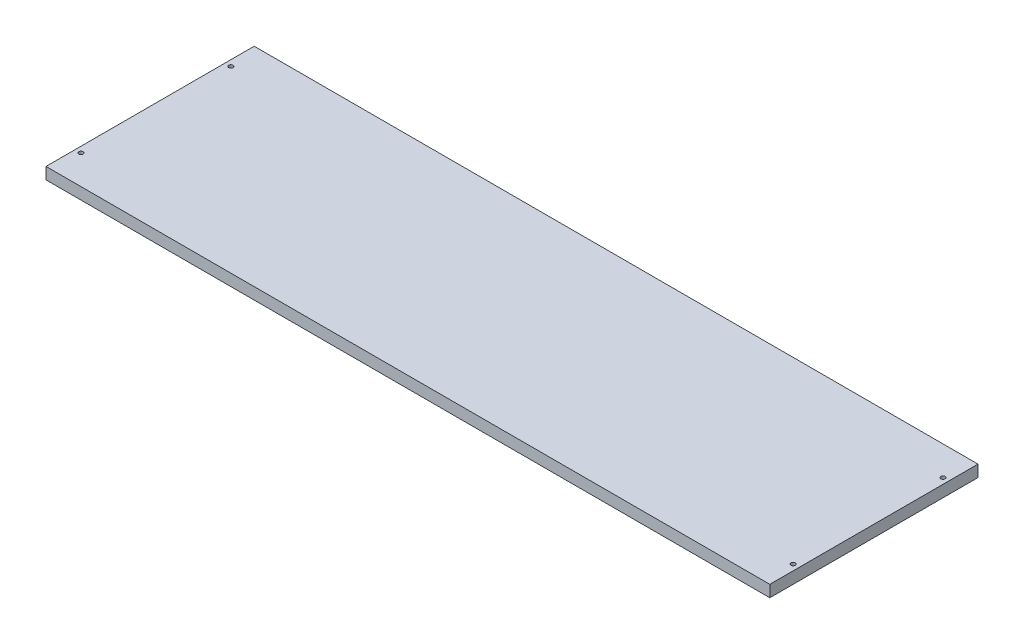
ISO-10303-21;
HEADER;
FILE_DESCRIPTION(('STEP AP214'),'2;1');
FILE_NAME('part.step','',(''),(''),'','','');
FILE_SCHEMA(('AUTOMOTIVE_DESIGN { 1 0 10303 214 1 1 1 1 }'));
ENDSEC;
DATA;
#1=APPLICATION_CONTEXT('core data for automotive mechanical design processes');
#2=APPLICATION_PROTOCOL_DEFINITION('international standard','automotive_design',2000,#1);
#3=PRODUCT_CONTEXT('',#1,'mechanical');
#4=PRODUCT('Part','Part','',(#3));
#5=PRODUCT_RELATED_PRODUCT_CATEGORY('part','',(#4));
#6=PRODUCT_DEFINITION_FORMATION('','',#4);
#7=PRODUCT_DEFINITION_CONTEXT('part definition',#1,'design');
#8=PRODUCT_DEFINITION('design','',#6,#7);
#9=PRODUCT_DEFINITION_SHAPE('','',#8);
#10=(LENGTH_UNIT() NAMED_UNIT(*) SI_UNIT(.MILLI.,.METRE.));
#11=(NAMED_UNIT(*) PLANE_ANGLE_UNIT() SI_UNIT($,.RADIAN.));
#12=(NAMED_UNIT(*) SI_UNIT($,.STERADIAN.) SOLID_ANGLE_UNIT());
#13=UNCERTAINTY_MEASURE_WITH_UNIT(LENGTH_MEASURE(1.E-05),#10,'distance_accuracy_value','');
#14=(GEOMETRIC_REPRESENTATION_CONTEXT(3) GLOBAL_UNCERTAINTY_ASSIGNED_CONTEXT((#13)) GLOBAL_UNIT_ASSIGNED_CONTEXT((#10,
#11,#12)) REPRESENTATION_CONTEXT('',''));
#15=CARTESIAN_POINT('',(0.,0.,0.));
#16=DIRECTION('',(0.,0.,1.));
#17=DIRECTION('',(1.,0.,0.));
#18=AXIS2_PLACEMENT_3D('',#15,#16,#17);
#19=CARTESIAN_POINT('',(0.,6.,0.));
#20=DIRECTION('',(0.,1.,0.));
#21=DIRECTION('',(0.,0.,1.));
#22=AXIS2_PLACEMENT_3D('',#19,#20,#21);
#23=PLANE('',#22);
#24=CARTESIAN_POINT('',(-3.,6.,-92.));
#25=DIRECTION('',(0.,1.,0.));
#26=DIRECTION('',(0.,0.,1.));
#27=AXIS2_PLACEMENT_3D('',#24,#25,#26);
#28=CIRCLE('',#27,1.1);
#29=CARTESIAN_POINT('',(-3.,6.,-90.9));
#30=VERTEX_POINT('',#29);
#31=EDGE_CURVE('E121',#30,#30,#28,.T.);
#32=ORIENTED_EDGE('',*,*,#31,.F.);
#33=EDGE_LOOP('',(#32));
#34=FACE_BOUND('',#33,.T.);
#35=CARTESIAN_POINT('',(-369.,6.,-92.));
#36=DIRECTION('',(0.,1.,0.));
#37=DIRECTION('',(0.,0.,1.));
#38=AXIS2_PLACEMENT_3D('',#35,#36,#37);
#39=CIRCLE('',#38,1.09999999999999);
#40=CARTESIAN_POINT('',(-369.,6.,-90.9));
#41=VERTEX_POINT('',#40);
#42=EDGE_CURVE('E100',#41,#41,#39,.T.);
#43=ORIENTED_EDGE('',*,*,#42,.F.);
#44=EDGE_LOOP('',(#43));
#45=FACE_BOUND('',#44,.T.);
#46=DIRECTION('',(0.,0.,1.));
#47=VECTOR('',#46,1.);
#48=CARTESIAN_POINT('',(-372.,6.,-107.));
#49=LINE('',#48,#47);
#50=CARTESIAN_POINT('',(-372.,6.,-107.));
#51=VERTEX_POINT('',#50);
#52=CARTESIAN_POINT('',(-372.,6.,0.));
#53=VERTEX_POINT('',#52);
#54=EDGE_CURVE('E85',#51,#53,#49,.T.);
#55=ORIENTED_EDGE('',*,*,#54,.T.);
#56=DIRECTION('',(1.,0.,0.));
#57=VECTOR('',#56,1.);
#58=CARTESIAN_POINT('',(-372.,6.,0.));
#59=LINE('',#58,#57);
#60=CARTESIAN_POINT('',(0.,6.,0.));
#61=VERTEX_POINT('',#60);
#62=EDGE_CURVE('E80',#53,#61,#59,.T.);
#63=ORIENTED_EDGE('',*,*,#62,.T.);
#64=DIRECTION('',(0.,0.,-1.));
#65=VECTOR('',#64,1.);
#66=CARTESIAN_POINT('',(0.,6.,-107.));
#67=LINE('',#66,#65);
#68=CARTESIAN_POINT('',(0.,6.,-107.));
#69=VERTEX_POINT('',#68);
#70=EDGE_CURVE('E83',#61,#69,#67,.T.);
#71=ORIENTED_EDGE('',*,*,#70,.T.);
#72=DIRECTION('',(-1.,0.,0.));
#73=VECTOR('',#72,1.);
#74=CARTESIAN_POINT('',(-372.,6.,-107.));
#75=LINE('',#74,#73);
#76=EDGE_CURVE('E50',#69,#51,#75,.T.);
#77=ORIENTED_EDGE('',*,*,#76,.T.);
#78=EDGE_LOOP('',(#55,#63,#71,#77));
#79=FACE_BOUND('',#78,.T.);
#80=CARTESIAN_POINT('',(-369.,6.,-15.));
#81=DIRECTION('',(0.,1.,0.));
#82=DIRECTION('',(0.,0.,1.));
#83=AXIS2_PLACEMENT_3D('',#80,#81,#82);
#84=CIRCLE('',#83,1.09999999999999);
#85=CARTESIAN_POINT('',(-369.,6.,-13.9));
#86=VERTEX_POINT('',#85);
#87=EDGE_CURVE('E115',#86,#86,#84,.T.);
#88=ORIENTED_EDGE('',*,*,#87,.F.);
#89=EDGE_LOOP('',(#88));
#90=FACE_BOUND('',#89,.T.);
#91=CARTESIAN_POINT('',(-3.,6.,-15.));
#92=DIRECTION('',(0.,1.,0.));
#93=DIRECTION('',(0.,0.,1.));
#94=AXIS2_PLACEMENT_3D('',#91,#92,#93);
#95=CIRCLE('',#94,1.1);
#96=CARTESIAN_POINT('',(-3.,6.,-13.9));
#97=VERTEX_POINT('',#96);
#98=EDGE_CURVE('E127',#97,#97,#95,.T.);
#99=ORIENTED_EDGE('',*,*,#98,.F.);
#100=EDGE_LOOP('',(#99));
#101=FACE_BOUND('',#100,.T.);
#102=ADVANCED_FACE('F33',(#34,#45,#79,#90,#101),#23,.T.);
#103=CARTESIAN_POINT('',(0.,0.,0.));
#104=DIRECTION('',(0.,1.,0.));
#105=DIRECTION('',(0.,0.,1.));
#106=AXIS2_PLACEMENT_3D('',#103,#104,#105);
#107=PLANE('',#106);
#108=CARTESIAN_POINT('',(-3.,0.,-92.));
#109=DIRECTION('',(0.,1.,0.));
#110=DIRECTION('',(0.,0.,1.));
#111=AXIS2_PLACEMENT_3D('',#108,#109,#110);
#112=CIRCLE('',#111,1.1);
#113=CARTESIAN_POINT('',(-3.,0.,-90.9));
#114=VERTEX_POINT('',#113);
#115=EDGE_CURVE('E124',#114,#114,#112,.T.);
#116=ORIENTED_EDGE('',*,*,#115,.T.);
#117=EDGE_LOOP('',(#116));
#118=FACE_BOUND('',#117,.T.);
#119=CARTESIAN_POINT('',(-369.,0.,-92.));
#120=DIRECTION('',(0.,1.,0.));
#121=DIRECTION('',(0.,0.,1.));
#122=AXIS2_PLACEMENT_3D('',#119,#120,#121);
#123=CIRCLE('',#122,1.09999999999999);
#124=CARTESIAN_POINT('',(-369.,0.,-90.9));
#125=VERTEX_POINT('',#124);
#126=EDGE_CURVE('E112',#125,#125,#123,.T.);
#127=ORIENTED_EDGE('',*,*,#126,.T.);
#128=EDGE_LOOP('',(#127));
#129=FACE_BOUND('',#128,.T.);
#130=DIRECTION('',(0.,0.,1.));
#131=VECTOR('',#130,1.);
#132=CARTESIAN_POINT('',(-372.,0.,-107.));
#133=LINE('',#132,#131);
#134=CARTESIAN_POINT('',(-372.,0.,-107.));
#135=VERTEX_POINT('',#134);
#136=CARTESIAN_POINT('',(-372.,0.,0.));
#137=VERTEX_POINT('',#136);
#138=EDGE_CURVE('E97',#135,#137,#133,.T.);
#139=ORIENTED_EDGE('',*,*,#138,.F.);
#140=DIRECTION('',(-1.,0.,0.));
#141=VECTOR('',#140,1.);
#142=CARTESIAN_POINT('',(-372.,0.,-107.));
#143=LINE('',#142,#141);
#144=CARTESIAN_POINT('',(0.,0.,-107.));
#145=VERTEX_POINT('',#144);
#146=EDGE_CURVE('E73',#145,#135,#143,.T.);
#147=ORIENTED_EDGE('',*,*,#146,.F.);
#148=DIRECTION('',(0.,0.,-1.));
#149=VECTOR('',#148,1.);
#150=CARTESIAN_POINT('',(0.,0.,-107.));
#151=LINE('',#150,#149);
#152=CARTESIAN_POINT('',(0.,0.,0.));
#153=VERTEX_POINT('',#152);
#154=EDGE_CURVE('E67',#153,#145,#151,.T.);
#155=ORIENTED_EDGE('',*,*,#154,.F.);
#156=DIRECTION('',(1.,0.,0.));
#157=VECTOR('',#156,1.);
#158=CARTESIAN_POINT('',(-372.,0.,0.));
#159=LINE('',#158,#157);
#160=EDGE_CURVE('E89',#137,#153,#159,.T.);
#161=ORIENTED_EDGE('',*,*,#160,.F.);
#162=EDGE_LOOP('',(#139,#147,#155,#161));
#163=FACE_BOUND('',#162,.T.);
#164=CARTESIAN_POINT('',(-369.,0.,-15.));
#165=DIRECTION('',(0.,1.,0.));
#166=DIRECTION('',(0.,0.,1.));
#167=AXIS2_PLACEMENT_3D('',#164,#165,#166);
#168=CIRCLE('',#167,1.09999999999999);
#169=CARTESIAN_POINT('',(-369.,0.,-13.9));
#170=VERTEX_POINT('',#169);
#171=EDGE_CURVE('E118',#170,#170,#168,.T.);
#172=ORIENTED_EDGE('',*,*,#171,.T.);
#173=EDGE_LOOP('',(#172));
#174=FACE_BOUND('',#173,.T.);
#175=CARTESIAN_POINT('',(-3.,0.,-15.));
#176=DIRECTION('',(0.,1.,0.));
#177=DIRECTION('',(0.,0.,1.));
#178=AXIS2_PLACEMENT_3D('',#175,#176,#177);
#179=CIRCLE('',#178,1.1);
#180=CARTESIAN_POINT('',(-3.,0.,-13.9));
#181=VERTEX_POINT('',#180);
#182=EDGE_CURVE('E130',#181,#181,#179,.T.);
#183=ORIENTED_EDGE('',*,*,#182,.T.);
#184=EDGE_LOOP('',(#183));
#185=FACE_BOUND('',#184,.T.);
#186=ADVANCED_FACE('F108',(#118,#129,#163,#174,#185),#107,.F.);
#187=CARTESIAN_POINT('',(-372.,6.,-107.));
#188=DIRECTION('',(1.,0.,0.));
#189=DIRECTION('',(0.,0.,-1.));
#190=AXIS2_PLACEMENT_3D('',#187,#188,#189);
#191=PLANE('',#190);
#192=ORIENTED_EDGE('',*,*,#138,.T.);
#193=DIRECTION('',(0.,-1.,0.));
#194=VECTOR('',#193,1.);
#195=CARTESIAN_POINT('',(-372.,6.,0.));
#196=LINE('',#195,#194);
#197=EDGE_CURVE('E11',#53,#137,#196,.T.);
#198=ORIENTED_EDGE('',*,*,#197,.F.);
#199=ORIENTED_EDGE('',*,*,#54,.F.);
#200=DIRECTION('',(0.,-1.,0.));
#201=VECTOR('',#200,1.);
#202=CARTESIAN_POINT('',(-372.,6.,-107.));
#203=LINE('',#202,#201);
#204=EDGE_CURVE('E93',#51,#135,#203,.T.);
#205=ORIENTED_EDGE('',*,*,#204,.T.);
#206=EDGE_LOOP('',(#192,#198,#199,#205));
#207=FACE_BOUND('',#206,.T.);
#208=ADVANCED_FACE('F35',(#207),#191,.F.);
#209=CARTESIAN_POINT('',(-372.,6.,0.));
#210=DIRECTION('',(0.,0.,-1.));
#211=DIRECTION('',(-1.,0.,0.));
#212=AXIS2_PLACEMENT_3D('',#209,#210,#211);
#213=PLANE('',#212);
#214=ORIENTED_EDGE('',*,*,#160,.T.);
#215=DIRECTION('',(0.,-1.,0.));
#216=VECTOR('',#215,1.);
#217=CARTESIAN_POINT('',(0.,6.,0.));
#218=LINE('',#217,#216);
#219=EDGE_CURVE('E42',#61,#153,#218,.T.);
#220=ORIENTED_EDGE('',*,*,#219,.F.);
#221=ORIENTED_EDGE('',*,*,#62,.F.);
#222=ORIENTED_EDGE('',*,*,#197,.T.);
#223=EDGE_LOOP('',(#214,#220,#221,#222));
#224=FACE_BOUND('',#223,.T.);
#225=ADVANCED_FACE('F88',(#224),#213,.F.);
#226=CARTESIAN_POINT('',(0.,6.,-107.));
#227=DIRECTION('',(-1.,0.,0.));
#228=DIRECTION('',(0.,0.,1.));
#229=AXIS2_PLACEMENT_3D('',#226,#227,#228);
#230=PLANE('',#229);
#231=ORIENTED_EDGE('',*,*,#154,.T.);
#232=DIRECTION('',(0.,-1.,0.));
#233=VECTOR('',#232,1.);
#234=CARTESIAN_POINT('',(0.,6.,-107.));
#235=LINE('',#234,#233);
#236=EDGE_CURVE('E90',#69,#145,#235,.T.);
#237=ORIENTED_EDGE('',*,*,#236,.F.);
#238=ORIENTED_EDGE('',*,*,#70,.F.);
#239=ORIENTED_EDGE('',*,*,#219,.T.);
#240=EDGE_LOOP('',(#231,#237,#238,#239));
#241=FACE_BOUND('',#240,.T.);
#242=ADVANCED_FACE('F91',(#241),#230,.F.);
#243=CARTESIAN_POINT('',(-372.,6.,-107.));
#244=DIRECTION('',(0.,0.,1.));
#245=DIRECTION('',(1.,0.,0.));
#246=AXIS2_PLACEMENT_3D('',#243,#244,#245);
#247=PLANE('',#246);
#248=ORIENTED_EDGE('',*,*,#146,.T.);
#249=ORIENTED_EDGE('',*,*,#204,.F.);
#250=ORIENTED_EDGE('',*,*,#76,.F.);
#251=ORIENTED_EDGE('',*,*,#236,.T.);
#252=EDGE_LOOP('',(#248,#249,#250,#251));
#253=FACE_BOUND('',#252,.T.);
#254=ADVANCED_FACE('F105',(#253),#247,.F.);
#255=CARTESIAN_POINT('',(-369.,6.,-92.));
#256=DIRECTION('',(0.,-1.,0.));
#257=DIRECTION('',(0.,0.,-1.));
#258=AXIS2_PLACEMENT_3D('',#255,#256,#257);
#259=CYLINDRICAL_SURFACE('',#258,1.09999999999999);
#260=ORIENTED_EDGE('',*,*,#42,.T.);
#261=EDGE_LOOP('',(#260));
#262=FACE_BOUND('',#261,.T.);
#263=ORIENTED_EDGE('',*,*,#126,.F.);
#264=EDGE_LOOP('',(#263));
#265=FACE_BOUND('',#264,.T.);
#266=ADVANCED_FACE('F150',(#262,#265),#259,.F.);
#267=CARTESIAN_POINT('',(-369.,6.,-15.));
#268=DIRECTION('',(0.,-1.,0.));
#269=DIRECTION('',(0.,0.,-1.));
#270=AXIS2_PLACEMENT_3D('',#267,#268,#269);
#271=CYLINDRICAL_SURFACE('',#270,1.09999999999999);
#272=ORIENTED_EDGE('',*,*,#87,.T.);
#273=EDGE_LOOP('',(#272));
#274=FACE_BOUND('',#273,.T.);
#275=ORIENTED_EDGE('',*,*,#171,.F.);
#276=EDGE_LOOP('',(#275));
#277=FACE_BOUND('',#276,.T.);
#278=ADVANCED_FACE('F196',(#274,#277),#271,.F.);
#279=CARTESIAN_POINT('',(-3.,6.,-92.));
#280=DIRECTION('',(0.,-1.,0.));
#281=DIRECTION('',(0.,0.,-1.));
#282=AXIS2_PLACEMENT_3D('',#279,#280,#281);
#283=CYLINDRICAL_SURFACE('',#282,1.1);
#284=ORIENTED_EDGE('',*,*,#31,.T.);
#285=EDGE_LOOP('',(#284));
#286=FACE_BOUND('',#285,.T.);
#287=ORIENTED_EDGE('',*,*,#115,.F.);
#288=EDGE_LOOP('',(#287));
#289=FACE_BOUND('',#288,.T.);
#290=ADVANCED_FACE('F204',(#286,#289),#283,.F.);
#291=CARTESIAN_POINT('',(-3.,6.,-15.));
#292=DIRECTION('',(0.,-1.,0.));
#293=DIRECTION('',(0.,0.,-1.));
#294=AXIS2_PLACEMENT_3D('',#291,#292,#293);
#295=CYLINDRICAL_SURFACE('',#294,1.1);
#296=ORIENTED_EDGE('',*,*,#98,.T.);
#297=EDGE_LOOP('',(#296));
#298=FACE_BOUND('',#297,.T.);
#299=ORIENTED_EDGE('',*,*,#182,.F.);
#300=EDGE_LOOP('',(#299));
#301=FACE_BOUND('',#300,.T.);
#302=ADVANCED_FACE('F136',(#298,#301),#295,.F.);
#303=CLOSED_SHELL('',(#102,#186,#208,#225,#242,#254,#266,#278,#290,#302));
#304=MANIFOLD_SOLID_BREP('B2',#303);
#305=ADVANCED_BREP_SHAPE_REPRESENTATION('',(#18,#304),#14);
#306=SHAPE_DEFINITION_REPRESENTATION(#9,#305);
ENDSEC;
END-ISO-10303-21;
